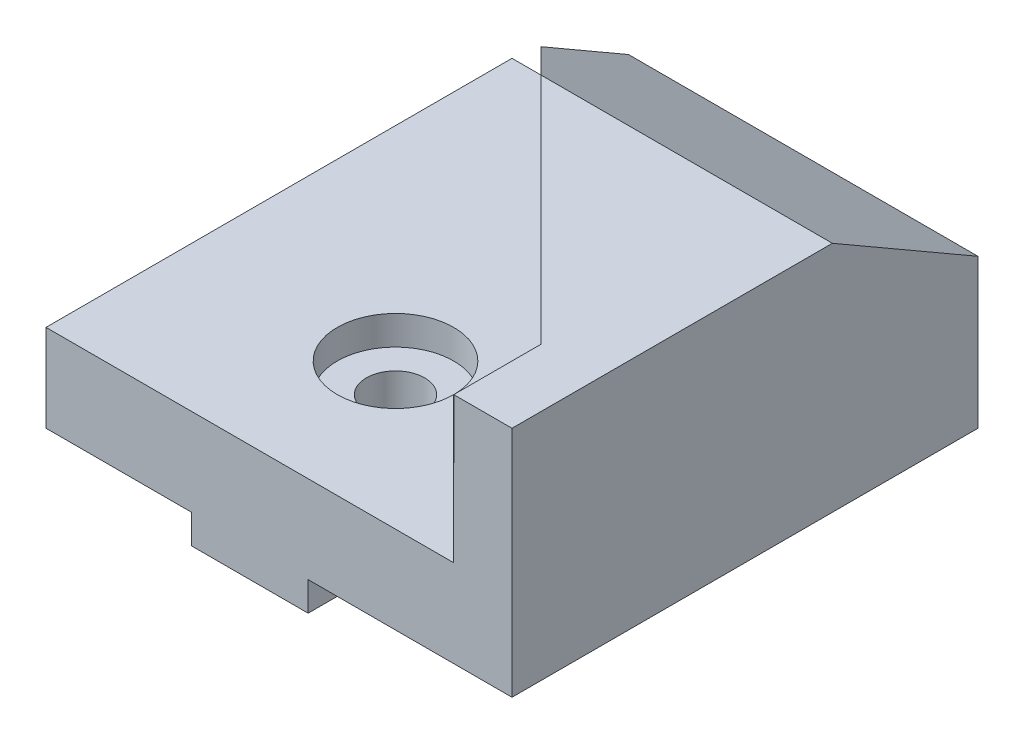
ISO-10303-21;
HEADER;
FILE_DESCRIPTION(('STEP AP214'),'2;1');
FILE_NAME('part.step','',(''),(''),'','','');
FILE_SCHEMA(('AUTOMOTIVE_DESIGN { 1 0 10303 214 1 1 1 1 }'));
ENDSEC;
DATA;
#1=APPLICATION_CONTEXT('core data for automotive mechanical design processes');
#2=APPLICATION_PROTOCOL_DEFINITION('international standard','automotive_design',2000,#1);
#3=PRODUCT_CONTEXT('',#1,'mechanical');
#4=PRODUCT('Part','Part','',(#3));
#5=PRODUCT_RELATED_PRODUCT_CATEGORY('part','',(#4));
#6=PRODUCT_DEFINITION_FORMATION('','',#4);
#7=PRODUCT_DEFINITION_CONTEXT('part definition',#1,'design');
#8=PRODUCT_DEFINITION('design','',#6,#7);
#9=PRODUCT_DEFINITION_SHAPE('','',#8);
#10=(LENGTH_UNIT() NAMED_UNIT(*) SI_UNIT(.MILLI.,.METRE.));
#11=(NAMED_UNIT(*) PLANE_ANGLE_UNIT() SI_UNIT($,.RADIAN.));
#12=(NAMED_UNIT(*) SI_UNIT($,.STERADIAN.) SOLID_ANGLE_UNIT());
#13=UNCERTAINTY_MEASURE_WITH_UNIT(LENGTH_MEASURE(1.E-05),#10,'distance_accuracy_value','');
#14=(GEOMETRIC_REPRESENTATION_CONTEXT(3) GLOBAL_UNCERTAINTY_ASSIGNED_CONTEXT((#13)) GLOBAL_UNIT_ASSIGNED_CONTEXT((#10,
#11,#12)) REPRESENTATION_CONTEXT('',''));
#15=CARTESIAN_POINT('',(0.,0.,0.));
#16=DIRECTION('',(0.,0.,1.));
#17=DIRECTION('',(1.,0.,0.));
#18=AXIS2_PLACEMENT_3D('',#15,#16,#17);
#19=CARTESIAN_POINT('',(35.,0.,55.));
#20=DIRECTION('',(0.,1.,0.));
#21=DIRECTION('',(0.,0.,1.));
#22=AXIS2_PLACEMENT_3D('',#19,#20,#21);
#23=CYLINDRICAL_SURFACE('',#22,5.);
#24=CARTESIAN_POINT('',(35.,0.,55.));
#25=DIRECTION('',(0.,1.,0.));
#26=DIRECTION('',(0.,0.,1.));
#27=AXIS2_PLACEMENT_3D('',#24,#25,#26);
#28=CIRCLE('',#27,5.);
#29=CARTESIAN_POINT('',(35.,0.,60.));
#30=VERTEX_POINT('',#29);
#31=EDGE_CURVE('E238',#30,#30,#28,.T.);
#32=ORIENTED_EDGE('',*,*,#31,.F.);
#33=EDGE_LOOP('',(#32));
#34=FACE_BOUND('',#33,.T.);
#35=CARTESIAN_POINT('',(35.,15.,55.));
#36=DIRECTION('',(0.,1.,0.));
#37=DIRECTION('',(0.,0.,1.));
#38=AXIS2_PLACEMENT_3D('',#35,#36,#37);
#39=CIRCLE('',#38,5.);
#40=CARTESIAN_POINT('',(35.,15.,60.));
#41=VERTEX_POINT('',#40);
#42=EDGE_CURVE('E37',#41,#41,#39,.F.);
#43=ORIENTED_EDGE('',*,*,#42,.F.);
#44=EDGE_LOOP('',(#43));
#45=FACE_BOUND('',#44,.T.);
#46=ADVANCED_FACE('F33',(#34,#45),#23,.F.);
#47=CARTESIAN_POINT('',(0.,5.,80.));
#48=DIRECTION('',(1.,0.,0.));
#49=DIRECTION('',(0.,0.,-1.));
#50=AXIS2_PLACEMENT_3D('',#47,#48,#49);
#51=PLANE('',#50);
#52=DIRECTION('',(0.,-1.,0.));
#53=VECTOR('',#52,1.);
#54=CARTESIAN_POINT('',(0.,5.,0.));
#55=LINE('',#54,#53);
#56=CARTESIAN_POINT('',(0.,20.,0.));
#57=VERTEX_POINT('',#56);
#58=CARTESIAN_POINT('',(0.,5.,0.));
#59=VERTEX_POINT('',#58);
#60=EDGE_CURVE('E151',#57,#59,#55,.T.);
#61=ORIENTED_EDGE('',*,*,#60,.T.);
#62=DIRECTION('',(0.,0.,-1.));
#63=VECTOR('',#62,1.);
#64=CARTESIAN_POINT('',(0.,5.,80.));
#65=LINE('',#64,#63);
#66=CARTESIAN_POINT('',(0.,5.,80.));
#67=VERTEX_POINT('',#66);
#68=EDGE_CURVE('E42',#67,#59,#65,.T.);
#69=ORIENTED_EDGE('',*,*,#68,.F.);
#70=DIRECTION('',(0.,-1.,0.));
#71=VECTOR('',#70,1.);
#72=CARTESIAN_POINT('',(0.,5.,80.));
#73=LINE('',#72,#71);
#74=CARTESIAN_POINT('',(0.,20.,80.));
#75=VERTEX_POINT('',#74);
#76=EDGE_CURVE('E169',#75,#67,#73,.T.);
#77=ORIENTED_EDGE('',*,*,#76,.F.);
#78=DIRECTION('',(0.,0.,-1.));
#79=VECTOR('',#78,1.);
#80=CARTESIAN_POINT('',(0.,20.,80.));
#81=LINE('',#80,#79);
#82=EDGE_CURVE('E150',#75,#57,#81,.T.);
#83=ORIENTED_EDGE('',*,*,#82,.T.);
#84=EDGE_LOOP('',(#61,#69,#77,#83));
#85=FACE_BOUND('',#84,.T.);
#86=ADVANCED_FACE('F35',(#85),#51,.F.);
#87=CARTESIAN_POINT('',(0.,5.,80.));
#88=DIRECTION('',(0.,1.,0.));
#89=DIRECTION('',(0.,0.,1.));
#90=AXIS2_PLACEMENT_3D('',#87,#88,#89);
#91=PLANE('',#90);
#92=DIRECTION('',(1.,0.,0.));
#93=VECTOR('',#92,1.);
#94=CARTESIAN_POINT('',(0.,5.,0.));
#95=LINE('',#94,#93);
#96=CARTESIAN_POINT('',(25.,5.,0.));
#97=VERTEX_POINT('',#96);
#98=EDGE_CURVE('E154',#59,#97,#95,.T.);
#99=ORIENTED_EDGE('',*,*,#98,.T.);
#100=DIRECTION('',(0.,0.,-1.));
#101=VECTOR('',#100,1.);
#102=CARTESIAN_POINT('',(25.,5.,80.));
#103=LINE('',#102,#101);
#104=CARTESIAN_POINT('',(25.,5.,80.));
#105=VERTEX_POINT('',#104);
#106=EDGE_CURVE('E181',#105,#97,#103,.T.);
#107=ORIENTED_EDGE('',*,*,#106,.F.);
#108=DIRECTION('',(1.,0.,0.));
#109=VECTOR('',#108,1.);
#110=CARTESIAN_POINT('',(0.,5.,80.));
#111=LINE('',#110,#109);
#112=EDGE_CURVE('E100',#67,#105,#111,.T.);
#113=ORIENTED_EDGE('',*,*,#112,.F.);
#114=ORIENTED_EDGE('',*,*,#68,.T.);
#115=EDGE_LOOP('',(#99,#107,#113,#114));
#116=FACE_BOUND('',#115,.T.);
#117=ADVANCED_FACE('F185',(#116),#91,.F.);
#118=CARTESIAN_POINT('',(25.,5.,80.));
#119=DIRECTION('',(1.,0.,0.));
#120=DIRECTION('',(0.,0.,-1.));
#121=AXIS2_PLACEMENT_3D('',#118,#119,#120);
#122=PLANE('',#121);
#123=DIRECTION('',(0.,-1.,0.));
#124=VECTOR('',#123,1.);
#125=CARTESIAN_POINT('',(25.,5.,0.));
#126=LINE('',#125,#124);
#127=CARTESIAN_POINT('',(25.,0.,0.));
#128=VERTEX_POINT('',#127);
#129=EDGE_CURVE('E157',#97,#128,#126,.T.);
#130=ORIENTED_EDGE('',*,*,#129,.T.);
#131=DIRECTION('',(0.,0.,-1.));
#132=VECTOR('',#131,1.);
#133=CARTESIAN_POINT('',(25.,0.,80.));
#134=LINE('',#133,#132);
#135=CARTESIAN_POINT('',(25.,0.,80.));
#136=VERTEX_POINT('',#135);
#137=EDGE_CURVE('E178',#136,#128,#134,.T.);
#138=ORIENTED_EDGE('',*,*,#137,.F.);
#139=DIRECTION('',(0.,-1.,0.));
#140=VECTOR('',#139,1.);
#141=CARTESIAN_POINT('',(25.,5.,80.));
#142=LINE('',#141,#140);
#143=EDGE_CURVE('E205',#105,#136,#142,.T.);
#144=ORIENTED_EDGE('',*,*,#143,.F.);
#145=ORIENTED_EDGE('',*,*,#106,.T.);
#146=EDGE_LOOP('',(#130,#138,#144,#145));
#147=FACE_BOUND('',#146,.T.);
#148=ADVANCED_FACE('F198',(#147),#122,.F.);
#149=CARTESIAN_POINT('',(25.,0.,80.));
#150=DIRECTION('',(0.,1.,0.));
#151=DIRECTION('',(0.,0.,1.));
#152=AXIS2_PLACEMENT_3D('',#149,#150,#151);
#153=PLANE('',#152);
#154=ORIENTED_EDGE('',*,*,#31,.T.);
#155=EDGE_LOOP('',(#154));
#156=FACE_BOUND('',#155,.T.);
#157=DIRECTION('',(1.,0.,0.));
#158=VECTOR('',#157,1.);
#159=CARTESIAN_POINT('',(25.,0.,0.));
#160=LINE('',#159,#158);
#161=CARTESIAN_POINT('',(45.,0.,0.));
#162=VERTEX_POINT('',#161);
#163=EDGE_CURVE('E159',#128,#162,#160,.T.);
#164=ORIENTED_EDGE('',*,*,#163,.T.);
#165=DIRECTION('',(0.,0.,-1.));
#166=VECTOR('',#165,1.);
#167=CARTESIAN_POINT('',(45.,0.,80.));
#168=LINE('',#167,#166);
#169=CARTESIAN_POINT('',(45.,0.,80.));
#170=VERTEX_POINT('',#169);
#171=EDGE_CURVE('E175',#170,#162,#168,.T.);
#172=ORIENTED_EDGE('',*,*,#171,.F.);
#173=DIRECTION('',(1.,0.,0.));
#174=VECTOR('',#173,1.);
#175=CARTESIAN_POINT('',(25.,0.,80.));
#176=LINE('',#175,#174);
#177=EDGE_CURVE('E204',#136,#170,#176,.T.);
#178=ORIENTED_EDGE('',*,*,#177,.F.);
#179=ORIENTED_EDGE('',*,*,#137,.T.);
#180=EDGE_LOOP('',(#164,#172,#178,#179));
#181=FACE_BOUND('',#180,.T.);
#182=ADVANCED_FACE('F202',(#156,#181),#153,.F.);
#183=CARTESIAN_POINT('',(45.,0.,80.));
#184=DIRECTION('',(-1.,0.,0.));
#185=DIRECTION('',(0.,0.,1.));
#186=AXIS2_PLACEMENT_3D('',#183,#184,#185);
#187=PLANE('',#186);
#188=DIRECTION('',(0.,1.,0.));
#189=VECTOR('',#188,1.);
#190=CARTESIAN_POINT('',(45.,0.,0.));
#191=LINE('',#190,#189);
#192=CARTESIAN_POINT('',(45.,5.,0.));
#193=VERTEX_POINT('',#192);
#194=EDGE_CURVE('E161',#162,#193,#191,.T.);
#195=ORIENTED_EDGE('',*,*,#194,.T.);
#196=DIRECTION('',(0.,0.,-1.));
#197=VECTOR('',#196,1.);
#198=CARTESIAN_POINT('',(45.,5.,80.));
#199=LINE('',#198,#197);
#200=CARTESIAN_POINT('',(45.,5.,80.));
#201=VERTEX_POINT('',#200);
#202=EDGE_CURVE('E137',#201,#193,#199,.T.);
#203=ORIENTED_EDGE('',*,*,#202,.F.);
#204=DIRECTION('',(0.,1.,0.));
#205=VECTOR('',#204,1.);
#206=CARTESIAN_POINT('',(45.,0.,80.));
#207=LINE('',#206,#205);
#208=EDGE_CURVE('E124',#170,#201,#207,.T.);
#209=ORIENTED_EDGE('',*,*,#208,.F.);
#210=ORIENTED_EDGE('',*,*,#171,.T.);
#211=EDGE_LOOP('',(#195,#203,#209,#210));
#212=FACE_BOUND('',#211,.T.);
#213=ADVANCED_FACE('F296',(#212),#187,.F.);
#214=CARTESIAN_POINT('',(45.,5.,80.));
#215=DIRECTION('',(0.,1.,0.));
#216=DIRECTION('',(0.,0.,1.));
#217=AXIS2_PLACEMENT_3D('',#214,#215,#216);
#218=PLANE('',#217);
#219=DIRECTION('',(1.,0.,0.));
#220=VECTOR('',#219,1.);
#221=CARTESIAN_POINT('',(45.,5.,0.));
#222=LINE('',#221,#220);
#223=CARTESIAN_POINT('',(80.,5.,0.));
#224=VERTEX_POINT('',#223);
#225=EDGE_CURVE('E133',#193,#224,#222,.T.);
#226=ORIENTED_EDGE('',*,*,#225,.T.);
#227=DIRECTION('',(0.,0.,-1.));
#228=VECTOR('',#227,1.);
#229=CARTESIAN_POINT('',(80.,5.,80.));
#230=LINE('',#229,#228);
#231=CARTESIAN_POINT('',(80.,5.,80.));
#232=VERTEX_POINT('',#231);
#233=EDGE_CURVE('E130',#232,#224,#230,.T.);
#234=ORIENTED_EDGE('',*,*,#233,.F.);
#235=DIRECTION('',(1.,0.,0.));
#236=VECTOR('',#235,1.);
#237=CARTESIAN_POINT('',(45.,5.,80.));
#238=LINE('',#237,#236);
#239=EDGE_CURVE('E116',#201,#232,#238,.T.);
#240=ORIENTED_EDGE('',*,*,#239,.F.);
#241=ORIENTED_EDGE('',*,*,#202,.T.);
#242=EDGE_LOOP('',(#226,#234,#240,#241));
#243=FACE_BOUND('',#242,.T.);
#244=ADVANCED_FACE('F131',(#243),#218,.F.);
#245=CARTESIAN_POINT('',(80.,5.,80.));
#246=DIRECTION('',(-1.,0.,0.));
#247=DIRECTION('',(0.,0.,1.));
#248=AXIS2_PLACEMENT_3D('',#245,#246,#247);
#249=PLANE('',#248);
#250=DIRECTION('',(0.,1.,0.));
#251=VECTOR('',#250,1.);
#252=CARTESIAN_POINT('',(80.,5.,0.));
#253=LINE('',#252,#251);
#254=CARTESIAN_POINT('',(80.,30.5662432702593,0.));
#255=VERTEX_POINT('',#254);
#256=EDGE_CURVE('E164',#224,#255,#253,.T.);
#257=ORIENTED_EDGE('',*,*,#256,.T.);
#258=DIRECTION('',(0.,0.500000000000001,0.866025403784438));
#259=VECTOR('',#258,1.);
#260=CARTESIAN_POINT('',(80.,45.,25.));
#261=LINE('',#260,#259);
#262=CARTESIAN_POINT('',(80.,45.,25.));
#263=VERTEX_POINT('',#262);
#264=EDGE_CURVE('E234',#255,#263,#261,.T.);
#265=ORIENTED_EDGE('',*,*,#264,.T.);
#266=DIRECTION('',(0.,0.,-1.));
#267=VECTOR('',#266,1.);
#268=CARTESIAN_POINT('',(80.,45.,80.));
#269=LINE('',#268,#267);
#270=CARTESIAN_POINT('',(80.,45.,80.));
#271=VERTEX_POINT('',#270);
#272=EDGE_CURVE('E138',#271,#263,#269,.T.);
#273=ORIENTED_EDGE('',*,*,#272,.F.);
#274=DIRECTION('',(0.,1.,0.));
#275=VECTOR('',#274,1.);
#276=CARTESIAN_POINT('',(80.,5.,80.));
#277=LINE('',#276,#275);
#278=EDGE_CURVE('E121',#232,#271,#277,.T.);
#279=ORIENTED_EDGE('',*,*,#278,.F.);
#280=ORIENTED_EDGE('',*,*,#233,.T.);
#281=EDGE_LOOP('',(#257,#265,#273,#279,#280));
#282=FACE_BOUND('',#281,.T.);
#283=ADVANCED_FACE('F140',(#282),#249,.F.);
#284=CARTESIAN_POINT('',(20.,45.,80.));
#285=DIRECTION('',(0.,-1.,0.));
#286=DIRECTION('',(0.,0.,-1.));
#287=AXIS2_PLACEMENT_3D('',#284,#285,#286);
#288=PLANE('',#287);
#289=ORIENTED_EDGE('',*,*,#272,.T.);
#290=DIRECTION('',(-1.,0.,0.));
#291=VECTOR('',#290,1.);
#292=CARTESIAN_POINT('',(80.,45.,25.));
#293=LINE('',#292,#291);
#294=CARTESIAN_POINT('',(29.9999999999998,45.,25.));
#295=VERTEX_POINT('',#294);
#296=EDGE_CURVE('E227',#263,#295,#293,.T.);
#297=ORIENTED_EDGE('',*,*,#296,.T.);
#298=DIRECTION('',(-0.707106781186549,0.,-0.707106781186546));
#299=VECTOR('',#298,1.);
#300=CARTESIAN_POINT('',(70.,45.,65.));
#301=LINE('',#300,#299);
#302=CARTESIAN_POINT('',(70.,45.,65.));
#303=VERTEX_POINT('',#302);
#304=EDGE_CURVE('E220',#303,#295,#301,.T.);
#305=ORIENTED_EDGE('',*,*,#304,.F.);
#306=DIRECTION('',(0.,0.,-1.));
#307=VECTOR('',#306,1.);
#308=CARTESIAN_POINT('',(70.,45.,80.));
#309=LINE('',#308,#307);
#310=CARTESIAN_POINT('',(70.,45.,80.));
#311=VERTEX_POINT('',#310);
#312=EDGE_CURVE('E224',#311,#303,#309,.T.);
#313=ORIENTED_EDGE('',*,*,#312,.F.);
#314=DIRECTION('',(-1.,0.,0.));
#315=VECTOR('',#314,1.);
#316=CARTESIAN_POINT('',(20.,45.,80.));
#317=LINE('',#316,#315);
#318=EDGE_CURVE('E144',#271,#311,#317,.T.);
#319=ORIENTED_EDGE('',*,*,#318,.F.);
#320=EDGE_LOOP('',(#289,#297,#305,#313,#319));
#321=FACE_BOUND('',#320,.T.);
#322=ADVANCED_FACE('F287',(#321),#288,.F.);
#323=CARTESIAN_POINT('',(20.,20.,80.));
#324=DIRECTION('',(1.,0.,0.));
#325=DIRECTION('',(0.,0.,-1.));
#326=AXIS2_PLACEMENT_3D('',#323,#324,#325);
#327=PLANE('',#326);
#328=DIRECTION('',(0.,1.,0.));
#329=VECTOR('',#328,1.);
#330=CARTESIAN_POINT('',(20.,20.,15.0000000000002));
#331=LINE('',#330,#329);
#332=CARTESIAN_POINT('',(20.,20.,15.0000000000002));
#333=VERTEX_POINT('',#332);
#334=CARTESIAN_POINT('',(20.,39.2264973081038,15.0000000000002));
#335=VERTEX_POINT('',#334);
#336=EDGE_CURVE('E155',#333,#335,#331,.T.);
#337=ORIENTED_EDGE('',*,*,#336,.T.);
#338=DIRECTION('',(0.,0.500000000000001,0.866025403784438));
#339=VECTOR('',#338,1.);
#340=CARTESIAN_POINT('',(20.,45.,25.));
#341=LINE('',#340,#339);
#342=CARTESIAN_POINT('',(20.,30.5662432702593,0.));
#343=VERTEX_POINT('',#342);
#344=EDGE_CURVE('E49',#343,#335,#341,.T.);
#345=ORIENTED_EDGE('',*,*,#344,.F.);
#346=DIRECTION('',(0.,-1.,0.));
#347=VECTOR('',#346,1.);
#348=CARTESIAN_POINT('',(20.,20.,0.));
#349=LINE('',#348,#347);
#350=CARTESIAN_POINT('',(20.,20.,0.));
#351=VERTEX_POINT('',#350);
#352=EDGE_CURVE('E166',#343,#351,#349,.T.);
#353=ORIENTED_EDGE('',*,*,#352,.T.);
#354=DIRECTION('',(0.,0.,-1.));
#355=VECTOR('',#354,1.);
#356=CARTESIAN_POINT('',(20.,20.,80.));
#357=LINE('',#356,#355);
#358=EDGE_CURVE('E171',#333,#351,#357,.T.);
#359=ORIENTED_EDGE('',*,*,#358,.F.);
#360=EDGE_LOOP('',(#337,#345,#353,#359));
#361=FACE_BOUND('',#360,.T.);
#362=ADVANCED_FACE('F283',(#361),#327,.F.);
#363=CARTESIAN_POINT('',(0.,20.,80.));
#364=DIRECTION('',(0.,-1.,0.));
#365=DIRECTION('',(0.,0.,-1.));
#366=AXIS2_PLACEMENT_3D('',#363,#364,#365);
#367=PLANE('',#366);
#368=CARTESIAN_POINT('',(35.,20.,55.));
#369=DIRECTION('',(0.,1.,0.));
#370=DIRECTION('',(0.,0.,1.));
#371=AXIS2_PLACEMENT_3D('',#368,#369,#370);
#372=CIRCLE('',#371,10.);
#373=CARTESIAN_POINT('',(35.,20.,65.));
#374=VERTEX_POINT('',#373);
#375=EDGE_CURVE('E242',#374,#374,#372,.T.);
#376=ORIENTED_EDGE('',*,*,#375,.F.);
#377=EDGE_LOOP('',(#376));
#378=FACE_BOUND('',#377,.T.);
#379=DIRECTION('',(-1.,0.,0.));
#380=VECTOR('',#379,1.);
#381=CARTESIAN_POINT('',(0.,20.,0.));
#382=LINE('',#381,#380);
#383=EDGE_CURVE('E91',#351,#57,#382,.T.);
#384=ORIENTED_EDGE('',*,*,#383,.T.);
#385=ORIENTED_EDGE('',*,*,#82,.F.);
#386=DIRECTION('',(-1.,0.,0.));
#387=VECTOR('',#386,1.);
#388=CARTESIAN_POINT('',(0.,20.,80.));
#389=LINE('',#388,#387);
#390=CARTESIAN_POINT('',(70.,20.,80.));
#391=VERTEX_POINT('',#390);
#392=EDGE_CURVE('E57',#391,#75,#389,.T.);
#393=ORIENTED_EDGE('',*,*,#392,.F.);
#394=DIRECTION('',(0.,0.,-1.));
#395=VECTOR('',#394,1.);
#396=CARTESIAN_POINT('',(70.,20.,80.));
#397=LINE('',#396,#395);
#398=CARTESIAN_POINT('',(70.,20.,65.));
#399=VERTEX_POINT('',#398);
#400=EDGE_CURVE('E223',#391,#399,#397,.T.);
#401=ORIENTED_EDGE('',*,*,#400,.T.);
#402=DIRECTION('',(-0.707106781186549,0.,-0.707106781186546));
#403=VECTOR('',#402,1.);
#404=CARTESIAN_POINT('',(70.,20.,65.));
#405=LINE('',#404,#403);
#406=EDGE_CURVE('E215',#399,#333,#405,.T.);
#407=ORIENTED_EDGE('',*,*,#406,.T.);
#408=ORIENTED_EDGE('',*,*,#358,.T.);
#409=EDGE_LOOP('',(#384,#385,#393,#401,#407,#408));
#410=FACE_BOUND('',#409,.T.);
#411=ADVANCED_FACE('F278',(#378,#410),#367,.F.);
#412=CARTESIAN_POINT('',(0.,0.,80.));
#413=DIRECTION('',(0.,0.,-1.));
#414=DIRECTION('',(-1.,0.,0.));
#415=AXIS2_PLACEMENT_3D('',#412,#413,#414);
#416=PLANE('',#415);
#417=ORIENTED_EDGE('',*,*,#318,.T.);
#418=DIRECTION('',(0.,1.,0.));
#419=VECTOR('',#418,1.);
#420=CARTESIAN_POINT('',(70.,20.,80.));
#421=LINE('',#420,#419);
#422=EDGE_CURVE('E211',#391,#311,#421,.T.);
#423=ORIENTED_EDGE('',*,*,#422,.F.);
#424=ORIENTED_EDGE('',*,*,#392,.T.);
#425=ORIENTED_EDGE('',*,*,#76,.T.);
#426=ORIENTED_EDGE('',*,*,#112,.T.);
#427=ORIENTED_EDGE('',*,*,#143,.T.);
#428=ORIENTED_EDGE('',*,*,#177,.T.);
#429=ORIENTED_EDGE('',*,*,#208,.T.);
#430=ORIENTED_EDGE('',*,*,#239,.T.);
#431=ORIENTED_EDGE('',*,*,#278,.T.);
#432=EDGE_LOOP('',(#417,#423,#424,#425,#426,#427,#428,#429,#430,#431));
#433=FACE_BOUND('',#432,.T.);
#434=ADVANCED_FACE('F119',(#433),#416,.F.);
#435=CARTESIAN_POINT('',(0.,0.,0.));
#436=DIRECTION('',(0.,0.,-1.));
#437=DIRECTION('',(-1.,0.,0.));
#438=AXIS2_PLACEMENT_3D('',#435,#436,#437);
#439=PLANE('',#438);
#440=DIRECTION('',(-1.,0.,0.));
#441=VECTOR('',#440,1.);
#442=CARTESIAN_POINT('',(80.,30.5662432702593,0.));
#443=LINE('',#442,#441);
#444=EDGE_CURVE('E232',#255,#343,#443,.T.);
#445=ORIENTED_EDGE('',*,*,#444,.F.);
#446=ORIENTED_EDGE('',*,*,#256,.F.);
#447=ORIENTED_EDGE('',*,*,#225,.F.);
#448=ORIENTED_EDGE('',*,*,#194,.F.);
#449=ORIENTED_EDGE('',*,*,#163,.F.);
#450=ORIENTED_EDGE('',*,*,#129,.F.);
#451=ORIENTED_EDGE('',*,*,#98,.F.);
#452=ORIENTED_EDGE('',*,*,#60,.F.);
#453=ORIENTED_EDGE('',*,*,#383,.F.);
#454=ORIENTED_EDGE('',*,*,#352,.F.);
#455=EDGE_LOOP('',(#445,#446,#447,#448,#449,#450,#451,#452,#453,#454));
#456=FACE_BOUND('',#455,.T.);
#457=ADVANCED_FACE('F191',(#456),#439,.T.);
#458=CARTESIAN_POINT('',(70.,20.,65.));
#459=DIRECTION('',(0.707106781186546,0.,-0.707106781186549));
#460=DIRECTION('',(-0.707106781186549,0.,-0.707106781186546));
#461=AXIS2_PLACEMENT_3D('',#458,#459,#460);
#462=PLANE('',#461);
#463=ORIENTED_EDGE('',*,*,#304,.T.);
#464=DIRECTION('',(-0.654653670707978,-0.377964473009228,-0.654653670707976));
#465=VECTOR('',#464,1.);
#466=CARTESIAN_POINT('',(58.0998185443968,61.2234378007872,53.0998185443969));
#467=LINE('',#466,#465);
#468=EDGE_CURVE('E11',#295,#335,#467,.T.);
#469=ORIENTED_EDGE('',*,*,#468,.T.);
#470=ORIENTED_EDGE('',*,*,#336,.F.);
#471=ORIENTED_EDGE('',*,*,#406,.F.);
#472=DIRECTION('',(0.,1.,0.));
#473=VECTOR('',#472,1.);
#474=CARTESIAN_POINT('',(70.,20.,65.));
#475=LINE('',#474,#473);
#476=EDGE_CURVE('E214',#399,#303,#475,.T.);
#477=ORIENTED_EDGE('',*,*,#476,.T.);
#478=EDGE_LOOP('',(#463,#469,#470,#471,#477));
#479=FACE_BOUND('',#478,.T.);
#480=ADVANCED_FACE('F269',(#479),#462,.F.);
#481=CARTESIAN_POINT('',(70.,20.,80.));
#482=DIRECTION('',(1.,0.,0.));
#483=DIRECTION('',(0.,0.,-1.));
#484=AXIS2_PLACEMENT_3D('',#481,#482,#483);
#485=PLANE('',#484);
#486=ORIENTED_EDGE('',*,*,#312,.T.);
#487=ORIENTED_EDGE('',*,*,#476,.F.);
#488=ORIENTED_EDGE('',*,*,#400,.F.);
#489=ORIENTED_EDGE('',*,*,#422,.T.);
#490=EDGE_LOOP('',(#486,#487,#488,#489));
#491=FACE_BOUND('',#490,.T.);
#492=ADVANCED_FACE('F268',(#491),#485,.F.);
#493=CARTESIAN_POINT('',(80.,45.,25.));
#494=DIRECTION('',(0.,-0.866025403784438,0.500000000000001));
#495=DIRECTION('',(0.,-0.500000000000001,-0.866025403784438));
#496=AXIS2_PLACEMENT_3D('',#493,#494,#495);
#497=PLANE('',#496);
#498=ORIENTED_EDGE('',*,*,#296,.F.);
#499=ORIENTED_EDGE('',*,*,#264,.F.);
#500=ORIENTED_EDGE('',*,*,#444,.T.);
#501=ORIENTED_EDGE('',*,*,#344,.T.);
#502=ORIENTED_EDGE('',*,*,#468,.F.);
#503=EDGE_LOOP('',(#498,#499,#500,#501,#502));
#504=FACE_BOUND('',#503,.T.);
#505=ADVANCED_FACE('F265',(#504),#497,.F.);
#506=CARTESIAN_POINT('',(35.,15.,55.));
#507=DIRECTION('',(0.,1.,0.));
#508=DIRECTION('',(0.,0.,1.));
#509=AXIS2_PLACEMENT_3D('',#506,#507,#508);
#510=PLANE('',#509);
#511=CARTESIAN_POINT('',(35.,15.,55.));
#512=DIRECTION('',(0.,1.,0.));
#513=DIRECTION('',(0.,0.,1.));
#514=AXIS2_PLACEMENT_3D('',#511,#512,#513);
#515=CIRCLE('',#514,10.);
#516=CARTESIAN_POINT('',(35.,15.,65.));
#517=VERTEX_POINT('',#516);
#518=EDGE_CURVE('E245',#517,#517,#515,.T.);
#519=ORIENTED_EDGE('',*,*,#518,.T.);
#520=EDGE_LOOP('',(#519));
#521=FACE_BOUND('',#520,.T.);
#522=ORIENTED_EDGE('',*,*,#42,.T.);
#523=EDGE_LOOP('',(#522));
#524=FACE_BOUND('',#523,.T.);
#525=ADVANCED_FACE('F252',(#521,#524),#510,.T.);
#526=CARTESIAN_POINT('',(35.,15.,55.));
#527=DIRECTION('',(0.,1.,0.));
#528=DIRECTION('',(0.,0.,1.));
#529=AXIS2_PLACEMENT_3D('',#526,#527,#528);
#530=CYLINDRICAL_SURFACE('',#529,10.);
#531=ORIENTED_EDGE('',*,*,#518,.F.);
#532=EDGE_LOOP('',(#531));
#533=FACE_BOUND('',#532,.T.);
#534=ORIENTED_EDGE('',*,*,#375,.T.);
#535=EDGE_LOOP('',(#534));
#536=FACE_BOUND('',#535,.T.);
#537=ADVANCED_FACE('F263',(#533,#536),#530,.F.);
#538=CLOSED_SHELL('',(#46,#86,#117,#148,#182,#213,#244,#283,#322,#362,#411,#434,#457,#480,#492,
#505,#525,#537));
#539=MANIFOLD_SOLID_BREP('B2',#538);
#540=ADVANCED_BREP_SHAPE_REPRESENTATION('',(#18,#539),#14);
#541=SHAPE_DEFINITION_REPRESENTATION(#9,#540);
ENDSEC;
END-ISO-10303-21;
